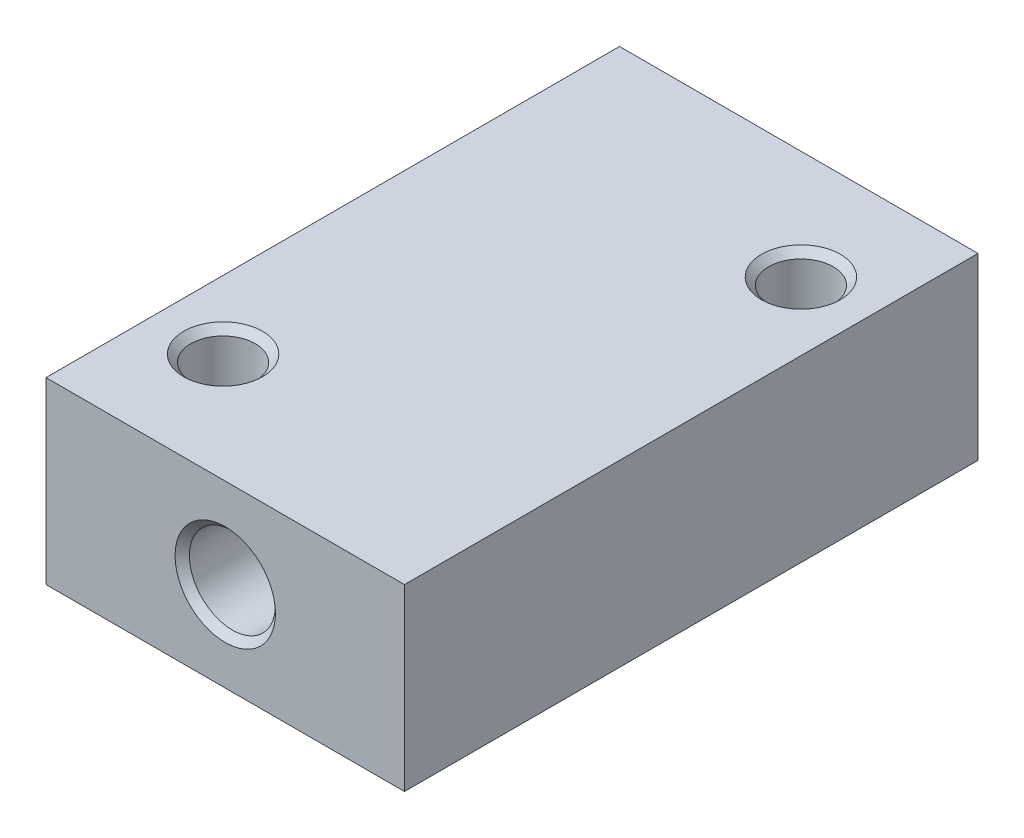
ISO-10303-21;
HEADER;
FILE_DESCRIPTION(('STEP AP214'),'2;1');
FILE_NAME('part.step','',(''),(''),'','','');
FILE_SCHEMA(('AUTOMOTIVE_DESIGN { 1 0 10303 214 1 1 1 1 }'));
ENDSEC;
DATA;
#1=APPLICATION_CONTEXT('core data for automotive mechanical design processes');
#2=APPLICATION_PROTOCOL_DEFINITION('international standard','automotive_design',2000,#1);
#3=PRODUCT_CONTEXT('',#1,'mechanical');
#4=PRODUCT('Part','Part','',(#3));
#5=PRODUCT_RELATED_PRODUCT_CATEGORY('part','',(#4));
#6=PRODUCT_DEFINITION_FORMATION('','',#4);
#7=PRODUCT_DEFINITION_CONTEXT('part definition',#1,'design');
#8=PRODUCT_DEFINITION('design','',#6,#7);
#9=PRODUCT_DEFINITION_SHAPE('','',#8);
#10=(LENGTH_UNIT() NAMED_UNIT(*) SI_UNIT(.MILLI.,.METRE.));
#11=(NAMED_UNIT(*) PLANE_ANGLE_UNIT() SI_UNIT($,.RADIAN.));
#12=(NAMED_UNIT(*) SI_UNIT($,.STERADIAN.) SOLID_ANGLE_UNIT());
#13=UNCERTAINTY_MEASURE_WITH_UNIT(LENGTH_MEASURE(1.E-05),#10,'distance_accuracy_value','');
#14=(GEOMETRIC_REPRESENTATION_CONTEXT(3) GLOBAL_UNCERTAINTY_ASSIGNED_CONTEXT((#13)) GLOBAL_UNIT_ASSIGNED_CONTEXT((#10,
#11,#12)) REPRESENTATION_CONTEXT('',''));
#15=CARTESIAN_POINT('',(0.,0.,0.));
#16=DIRECTION('',(0.,0.,1.));
#17=DIRECTION('',(1.,0.,0.));
#18=AXIS2_PLACEMENT_3D('',#15,#16,#17);
#19=CARTESIAN_POINT('',(0.,25.,0.));
#20=DIRECTION('',(0.,1.,0.));
#21=DIRECTION('',(0.,0.,1.));
#22=AXIS2_PLACEMENT_3D('',#19,#20,#21);
#23=PLANE('',#22);
#24=CARTESIAN_POINT('',(15.5,25.,-24.8));
#25=DIRECTION('',(0.,1.,0.));
#26=DIRECTION('',(0.,0.,1.));
#27=AXIS2_PLACEMENT_3D('',#24,#25,#26);
#28=CIRCLE('',#27,5.50000000000001);
#29=CARTESIAN_POINT('',(15.5,25.,-19.3));
#30=VERTEX_POINT('',#29);
#31=EDGE_CURVE('E11',#30,#30,#28,.F.);
#32=ORIENTED_EDGE('',*,*,#31,.T.);
#33=EDGE_LOOP('',(#32));
#34=FACE_BOUND('',#33,.T.);
#35=CARTESIAN_POINT('',(-15.5,25.,24.8));
#36=DIRECTION('',(0.,1.,0.));
#37=DIRECTION('',(0.,0.,1.));
#38=AXIS2_PLACEMENT_3D('',#35,#36,#37);
#39=CIRCLE('',#38,5.50000000000001);
#40=CARTESIAN_POINT('',(-15.5,25.,30.3000000000001));
#41=VERTEX_POINT('',#40);
#42=EDGE_CURVE('E43',#41,#41,#39,.F.);
#43=ORIENTED_EDGE('',*,*,#42,.T.);
#44=EDGE_LOOP('',(#43));
#45=FACE_BOUND('',#44,.T.);
#46=DIRECTION('',(0.,0.,-1.));
#47=VECTOR('',#46,1.);
#48=CARTESIAN_POINT('',(25.,25.,-40.));
#49=LINE('',#48,#47);
#50=CARTESIAN_POINT('',(25.,25.,40.));
#51=VERTEX_POINT('',#50);
#52=CARTESIAN_POINT('',(25.,25.,-40.));
#53=VERTEX_POINT('',#52);
#54=EDGE_CURVE('E86',#51,#53,#49,.T.);
#55=ORIENTED_EDGE('',*,*,#54,.T.);
#56=DIRECTION('',(-1.,0.,0.));
#57=VECTOR('',#56,1.);
#58=CARTESIAN_POINT('',(-25.,25.,-40.));
#59=LINE('',#58,#57);
#60=CARTESIAN_POINT('',(-25.,25.,-40.));
#61=VERTEX_POINT('',#60);
#62=EDGE_CURVE('E82',#53,#61,#59,.T.);
#63=ORIENTED_EDGE('',*,*,#62,.T.);
#64=DIRECTION('',(0.,0.,1.));
#65=VECTOR('',#64,1.);
#66=CARTESIAN_POINT('',(-25.,25.,-40.));
#67=LINE('',#66,#65);
#68=CARTESIAN_POINT('',(-25.,25.,40.));
#69=VERTEX_POINT('',#68);
#70=EDGE_CURVE('E84',#61,#69,#67,.T.);
#71=ORIENTED_EDGE('',*,*,#70,.T.);
#72=DIRECTION('',(1.,0.,0.));
#73=VECTOR('',#72,1.);
#74=CARTESIAN_POINT('',(-25.,25.,40.));
#75=LINE('',#74,#73);
#76=EDGE_CURVE('E51',#69,#51,#75,.T.);
#77=ORIENTED_EDGE('',*,*,#76,.T.);
#78=EDGE_LOOP('',(#55,#63,#71,#77));
#79=FACE_BOUND('',#78,.T.);
#80=ADVANCED_FACE('F34',(#34,#45,#79),#23,.T.);
#81=CARTESIAN_POINT('',(0.,0.,0.));
#82=DIRECTION('',(0.,1.,0.));
#83=DIRECTION('',(0.,0.,1.));
#84=AXIS2_PLACEMENT_3D('',#81,#82,#83);
#85=PLANE('',#84);
#86=CARTESIAN_POINT('',(15.5,0.,-24.8));
#87=DIRECTION('',(0.,1.,0.));
#88=DIRECTION('',(0.,0.,1.));
#89=AXIS2_PLACEMENT_3D('',#86,#87,#88);
#90=CIRCLE('',#89,5.50000000000002);
#91=CARTESIAN_POINT('',(15.5,0.,-19.3));
#92=VERTEX_POINT('',#91);
#93=EDGE_CURVE('E125',#92,#92,#90,.T.);
#94=ORIENTED_EDGE('',*,*,#93,.T.);
#95=EDGE_LOOP('',(#94));
#96=FACE_BOUND('',#95,.T.);
#97=CARTESIAN_POINT('',(-15.5,0.,24.8));
#98=DIRECTION('',(0.,1.,0.));
#99=DIRECTION('',(0.,0.,1.));
#100=AXIS2_PLACEMENT_3D('',#97,#98,#99);
#101=CIRCLE('',#100,5.50000000000002);
#102=CARTESIAN_POINT('',(-15.5,0.,30.3000000000001));
#103=VERTEX_POINT('',#102);
#104=EDGE_CURVE('E122',#103,#103,#101,.T.);
#105=ORIENTED_EDGE('',*,*,#104,.T.);
#106=EDGE_LOOP('',(#105));
#107=FACE_BOUND('',#106,.T.);
#108=DIRECTION('',(0.,0.,-1.));
#109=VECTOR('',#108,1.);
#110=CARTESIAN_POINT('',(25.,0.,-40.));
#111=LINE('',#110,#109);
#112=CARTESIAN_POINT('',(25.,0.,40.));
#113=VERTEX_POINT('',#112);
#114=CARTESIAN_POINT('',(25.,0.,-40.));
#115=VERTEX_POINT('',#114);
#116=EDGE_CURVE('E101',#113,#115,#111,.T.);
#117=ORIENTED_EDGE('',*,*,#116,.F.);
#118=DIRECTION('',(1.,0.,0.));
#119=VECTOR('',#118,1.);
#120=CARTESIAN_POINT('',(-25.,0.,40.));
#121=LINE('',#120,#119);
#122=CARTESIAN_POINT('',(-25.,0.,40.));
#123=VERTEX_POINT('',#122);
#124=EDGE_CURVE('E74',#123,#113,#121,.T.);
#125=ORIENTED_EDGE('',*,*,#124,.F.);
#126=DIRECTION('',(0.,0.,1.));
#127=VECTOR('',#126,1.);
#128=CARTESIAN_POINT('',(-25.,0.,-40.));
#129=LINE('',#128,#127);
#130=CARTESIAN_POINT('',(-25.,0.,-40.));
#131=VERTEX_POINT('',#130);
#132=EDGE_CURVE('E68',#131,#123,#129,.T.);
#133=ORIENTED_EDGE('',*,*,#132,.F.);
#134=DIRECTION('',(-1.,0.,0.));
#135=VECTOR('',#134,1.);
#136=CARTESIAN_POINT('',(-25.,0.,-40.));
#137=LINE('',#136,#135);
#138=EDGE_CURVE('E91',#115,#131,#137,.T.);
#139=ORIENTED_EDGE('',*,*,#138,.F.);
#140=EDGE_LOOP('',(#117,#125,#133,#139));
#141=FACE_BOUND('',#140,.T.);
#142=ADVANCED_FACE('F165',(#96,#107,#141),#85,.F.);
#143=CARTESIAN_POINT('',(25.,25.,-40.));
#144=DIRECTION('',(-1.,0.,0.));
#145=DIRECTION('',(0.,0.,1.));
#146=AXIS2_PLACEMENT_3D('',#143,#144,#145);
#147=PLANE('',#146);
#148=ORIENTED_EDGE('',*,*,#116,.T.);
#149=DIRECTION('',(0.,-1.,0.));
#150=VECTOR('',#149,1.);
#151=CARTESIAN_POINT('',(25.,25.,-40.));
#152=LINE('',#151,#150);
#153=EDGE_CURVE('E92',#53,#115,#152,.T.);
#154=ORIENTED_EDGE('',*,*,#153,.F.);
#155=ORIENTED_EDGE('',*,*,#54,.F.);
#156=DIRECTION('',(0.,-1.,0.));
#157=VECTOR('',#156,1.);
#158=CARTESIAN_POINT('',(25.,25.,40.));
#159=LINE('',#158,#157);
#160=EDGE_CURVE('E97',#51,#113,#159,.T.);
#161=ORIENTED_EDGE('',*,*,#160,.T.);
#162=EDGE_LOOP('',(#148,#154,#155,#161));
#163=FACE_BOUND('',#162,.T.);
#164=ADVANCED_FACE('F171',(#163),#147,.F.);
#165=CARTESIAN_POINT('',(-25.,25.,-40.));
#166=DIRECTION('',(0.,0.,1.));
#167=DIRECTION('',(1.,0.,0.));
#168=AXIS2_PLACEMENT_3D('',#165,#166,#167);
#169=PLANE('',#168);
#170=CARTESIAN_POINT('',(0.,12.5,-40.));
#171=DIRECTION('',(0.,0.,1.));
#172=DIRECTION('',(1.,0.,0.));
#173=AXIS2_PLACEMENT_3D('',#170,#171,#172);
#174=CIRCLE('',#173,7.00000000000002);
#175=CARTESIAN_POINT('',(7.00000000000002,12.5,-40.));
#176=VERTEX_POINT('',#175);
#177=EDGE_CURVE('E110',#176,#176,#174,.T.);
#178=ORIENTED_EDGE('',*,*,#177,.T.);
#179=EDGE_LOOP('',(#178));
#180=FACE_BOUND('',#179,.T.);
#181=ORIENTED_EDGE('',*,*,#138,.T.);
#182=DIRECTION('',(0.,-1.,0.));
#183=VECTOR('',#182,1.);
#184=CARTESIAN_POINT('',(-25.,25.,-40.));
#185=LINE('',#184,#183);
#186=EDGE_CURVE('E89',#61,#131,#185,.T.);
#187=ORIENTED_EDGE('',*,*,#186,.F.);
#188=ORIENTED_EDGE('',*,*,#62,.F.);
#189=ORIENTED_EDGE('',*,*,#153,.T.);
#190=EDGE_LOOP('',(#181,#187,#188,#189));
#191=FACE_BOUND('',#190,.T.);
#192=ADVANCED_FACE('F90',(#180,#191),#169,.F.);
#193=CARTESIAN_POINT('',(-25.,25.,-40.));
#194=DIRECTION('',(1.,0.,0.));
#195=DIRECTION('',(0.,0.,-1.));
#196=AXIS2_PLACEMENT_3D('',#193,#194,#195);
#197=PLANE('',#196);
#198=ORIENTED_EDGE('',*,*,#132,.T.);
#199=DIRECTION('',(0.,-1.,0.));
#200=VECTOR('',#199,1.);
#201=CARTESIAN_POINT('',(-25.,25.,40.));
#202=LINE('',#201,#200);
#203=EDGE_CURVE('E93',#69,#123,#202,.T.);
#204=ORIENTED_EDGE('',*,*,#203,.F.);
#205=ORIENTED_EDGE('',*,*,#70,.F.);
#206=ORIENTED_EDGE('',*,*,#186,.T.);
#207=EDGE_LOOP('',(#198,#204,#205,#206));
#208=FACE_BOUND('',#207,.T.);
#209=ADVANCED_FACE('F95',(#208),#197,.F.);
#210=CARTESIAN_POINT('',(-25.,25.,40.));
#211=DIRECTION('',(0.,0.,-1.));
#212=DIRECTION('',(-1.,0.,0.));
#213=AXIS2_PLACEMENT_3D('',#210,#211,#212);
#214=PLANE('',#213);
#215=CARTESIAN_POINT('',(0.,12.5,40.));
#216=DIRECTION('',(0.,0.,-1.));
#217=DIRECTION('',(-1.,0.,0.));
#218=AXIS2_PLACEMENT_3D('',#215,#216,#217);
#219=CIRCLE('',#218,7.00000000000002);
#220=CARTESIAN_POINT('',(-7.00000000000002,12.5,40.));
#221=VERTEX_POINT('',#220);
#222=EDGE_CURVE('E119',#221,#221,#219,.T.);
#223=ORIENTED_EDGE('',*,*,#222,.T.);
#224=EDGE_LOOP('',(#223));
#225=FACE_BOUND('',#224,.T.);
#226=ORIENTED_EDGE('',*,*,#124,.T.);
#227=ORIENTED_EDGE('',*,*,#160,.F.);
#228=ORIENTED_EDGE('',*,*,#76,.F.);
#229=ORIENTED_EDGE('',*,*,#203,.T.);
#230=EDGE_LOOP('',(#226,#227,#228,#229));
#231=FACE_BOUND('',#230,.T.);
#232=ADVANCED_FACE('F161',(#225,#231),#214,.F.);
#233=CARTESIAN_POINT('',(15.5,25.,-24.8));
#234=DIRECTION('',(0.,-1.,0.));
#235=DIRECTION('',(0.,0.,-1.));
#236=AXIS2_PLACEMENT_3D('',#233,#234,#235);
#237=CYLINDRICAL_SURFACE('',#236,4.5);
#238=CARTESIAN_POINT('',(15.5,1.00000000000001,-24.8));
#239=DIRECTION('',(0.,1.,0.));
#240=DIRECTION('',(0.,0.,1.));
#241=AXIS2_PLACEMENT_3D('',#238,#239,#240);
#242=CIRCLE('',#241,4.5);
#243=CARTESIAN_POINT('',(15.5,1.00000000000001,-20.3));
#244=VERTEX_POINT('',#243);
#245=EDGE_CURVE('E131',#244,#244,#242,.F.);
#246=ORIENTED_EDGE('',*,*,#245,.T.);
#247=EDGE_LOOP('',(#246));
#248=FACE_BOUND('',#247,.T.);
#249=CARTESIAN_POINT('',(15.5,24.,-24.8));
#250=DIRECTION('',(0.,1.,0.));
#251=DIRECTION('',(0.,0.,1.));
#252=AXIS2_PLACEMENT_3D('',#249,#250,#251);
#253=CIRCLE('',#252,4.5);
#254=CARTESIAN_POINT('',(15.5,24.,-20.3));
#255=VERTEX_POINT('',#254);
#256=EDGE_CURVE('E128',#255,#255,#253,.T.);
#257=ORIENTED_EDGE('',*,*,#256,.T.);
#258=EDGE_LOOP('',(#257));
#259=FACE_BOUND('',#258,.T.);
#260=ADVANCED_FACE('F151',(#248,#259),#237,.F.);
#261=CARTESIAN_POINT('',(-15.5,25.,24.8));
#262=DIRECTION('',(0.,-1.,0.));
#263=DIRECTION('',(0.,0.,-1.));
#264=AXIS2_PLACEMENT_3D('',#261,#262,#263);
#265=CYLINDRICAL_SURFACE('',#264,4.5);
#266=CARTESIAN_POINT('',(-15.5,1.00000000000001,24.8));
#267=DIRECTION('',(0.,1.,0.));
#268=DIRECTION('',(0.,0.,1.));
#269=AXIS2_PLACEMENT_3D('',#266,#267,#268);
#270=CIRCLE('',#269,4.5);
#271=CARTESIAN_POINT('',(-15.5,1.00000000000001,29.3));
#272=VERTEX_POINT('',#271);
#273=EDGE_CURVE('E137',#272,#272,#270,.F.);
#274=ORIENTED_EDGE('',*,*,#273,.T.);
#275=EDGE_LOOP('',(#274));
#276=FACE_BOUND('',#275,.T.);
#277=CARTESIAN_POINT('',(-15.5,24.,24.8));
#278=DIRECTION('',(0.,1.,0.));
#279=DIRECTION('',(0.,0.,1.));
#280=AXIS2_PLACEMENT_3D('',#277,#278,#279);
#281=CIRCLE('',#280,4.5);
#282=CARTESIAN_POINT('',(-15.5,24.,29.3));
#283=VERTEX_POINT('',#282);
#284=EDGE_CURVE('E134',#283,#283,#281,.T.);
#285=ORIENTED_EDGE('',*,*,#284,.T.);
#286=EDGE_LOOP('',(#285));
#287=FACE_BOUND('',#286,.T.);
#288=ADVANCED_FACE('F148',(#276,#287),#265,.F.);
#289=CARTESIAN_POINT('',(0.,12.5,-40.));
#290=DIRECTION('',(0.,0.,1.));
#291=DIRECTION('',(1.,0.,0.));
#292=AXIS2_PLACEMENT_3D('',#289,#290,#291);
#293=CYLINDRICAL_SURFACE('',#292,6.);
#294=CARTESIAN_POINT('',(0.,12.5,-39.));
#295=DIRECTION('',(0.,0.,1.));
#296=DIRECTION('',(1.,0.,0.));
#297=AXIS2_PLACEMENT_3D('',#294,#295,#296);
#298=CIRCLE('',#297,6.);
#299=CARTESIAN_POINT('',(6.,12.5,-39.));
#300=VERTEX_POINT('',#299);
#301=EDGE_CURVE('E116',#300,#300,#298,.F.);
#302=ORIENTED_EDGE('',*,*,#301,.T.);
#303=EDGE_LOOP('',(#302));
#304=FACE_BOUND('',#303,.T.);
#305=CARTESIAN_POINT('',(0.,12.5,39.));
#306=DIRECTION('',(0.,0.,-1.));
#307=DIRECTION('',(-1.,0.,0.));
#308=AXIS2_PLACEMENT_3D('',#305,#306,#307);
#309=CIRCLE('',#308,6.);
#310=CARTESIAN_POINT('',(-6.,12.5,39.));
#311=VERTEX_POINT('',#310);
#312=EDGE_CURVE('E113',#311,#311,#309,.F.);
#313=ORIENTED_EDGE('',*,*,#312,.T.);
#314=EDGE_LOOP('',(#313));
#315=FACE_BOUND('',#314,.T.);
#316=ADVANCED_FACE('F150',(#304,#315),#293,.F.);
#317=CARTESIAN_POINT('',(0.,12.5,-40.));
#318=DIRECTION('',(0.,0.,-1.));
#319=DIRECTION('',(-1.,0.,0.));
#320=AXIS2_PLACEMENT_3D('',#317,#318,#319);
#321=CONICAL_SURFACE('',#320,7.00000000000002,0.78539816339745);
#322=ORIENTED_EDGE('',*,*,#301,.F.);
#323=EDGE_LOOP('',(#322));
#324=FACE_BOUND('',#323,.T.);
#325=ORIENTED_EDGE('',*,*,#177,.F.);
#326=EDGE_LOOP('',(#325));
#327=FACE_BOUND('',#326,.T.);
#328=ADVANCED_FACE('F158',(#324,#327),#321,.F.);
#329=CARTESIAN_POINT('',(0.,12.5,39.));
#330=DIRECTION('',(0.,0.,1.));
#331=DIRECTION('',(1.,0.,0.));
#332=AXIS2_PLACEMENT_3D('',#329,#330,#331);
#333=CONICAL_SURFACE('',#332,6.,0.785398163397458);
#334=ORIENTED_EDGE('',*,*,#222,.F.);
#335=EDGE_LOOP('',(#334));
#336=FACE_BOUND('',#335,.T.);
#337=ORIENTED_EDGE('',*,*,#312,.F.);
#338=EDGE_LOOP('',(#337));
#339=FACE_BOUND('',#338,.T.);
#340=ADVANCED_FACE('F188',(#336,#339),#333,.F.);
#341=CARTESIAN_POINT('',(15.5,0.,-24.8));
#342=DIRECTION('',(0.,-1.,0.));
#343=DIRECTION('',(0.,0.,-1.));
#344=AXIS2_PLACEMENT_3D('',#341,#342,#343);
#345=CONICAL_SURFACE('',#344,5.50000000000002,0.78539816339745);
#346=ORIENTED_EDGE('',*,*,#245,.F.);
#347=EDGE_LOOP('',(#346));
#348=FACE_BOUND('',#347,.T.);
#349=ORIENTED_EDGE('',*,*,#93,.F.);
#350=EDGE_LOOP('',(#349));
#351=FACE_BOUND('',#350,.T.);
#352=ADVANCED_FACE('F192',(#348,#351),#345,.F.);
#353=CARTESIAN_POINT('',(-15.5,0.,24.8));
#354=DIRECTION('',(0.,-1.,0.));
#355=DIRECTION('',(0.,0.,-1.));
#356=AXIS2_PLACEMENT_3D('',#353,#354,#355);
#357=CONICAL_SURFACE('',#356,5.50000000000002,0.78539816339745);
#358=ORIENTED_EDGE('',*,*,#273,.F.);
#359=EDGE_LOOP('',(#358));
#360=FACE_BOUND('',#359,.T.);
#361=ORIENTED_EDGE('',*,*,#104,.F.);
#362=EDGE_LOOP('',(#361));
#363=FACE_BOUND('',#362,.T.);
#364=ADVANCED_FACE('F196',(#360,#363),#357,.F.);
#365=CARTESIAN_POINT('',(15.5,24.,-24.8));
#366=DIRECTION('',(0.,1.,0.));
#367=DIRECTION('',(0.,0.,1.));
#368=AXIS2_PLACEMENT_3D('',#365,#366,#367);
#369=CONICAL_SURFACE('',#368,4.5,0.785398163397448);
#370=ORIENTED_EDGE('',*,*,#31,.F.);
#371=EDGE_LOOP('',(#370));
#372=FACE_BOUND('',#371,.T.);
#373=ORIENTED_EDGE('',*,*,#256,.F.);
#374=EDGE_LOOP('',(#373));
#375=FACE_BOUND('',#374,.T.);
#376=ADVANCED_FACE('F145',(#372,#375),#369,.F.);
#377=CARTESIAN_POINT('',(-15.5,24.,24.8));
#378=DIRECTION('',(0.,1.,0.));
#379=DIRECTION('',(0.,0.,1.));
#380=AXIS2_PLACEMENT_3D('',#377,#378,#379);
#381=CONICAL_SURFACE('',#380,4.5,0.785398163397448);
#382=ORIENTED_EDGE('',*,*,#42,.F.);
#383=EDGE_LOOP('',(#382));
#384=FACE_BOUND('',#383,.T.);
#385=ORIENTED_EDGE('',*,*,#284,.F.);
#386=EDGE_LOOP('',(#385));
#387=FACE_BOUND('',#386,.T.);
#388=ADVANCED_FACE('F36',(#384,#387),#381,.F.);
#389=CLOSED_SHELL('',(#80,#142,#164,#192,#209,#232,#260,#288,#316,#328,#340,#352,#364,#376,#388));
#390=MANIFOLD_SOLID_BREP('B2',#389);
#391=ADVANCED_BREP_SHAPE_REPRESENTATION('',(#18,#390),#14);
#392=SHAPE_DEFINITION_REPRESENTATION(#9,#391);
ENDSEC;
END-ISO-10303-21;
